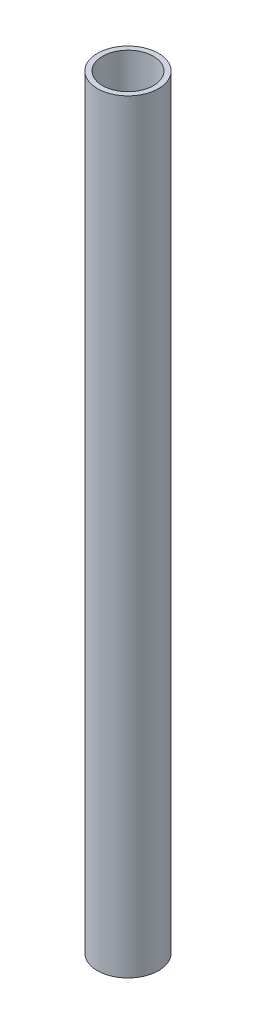
ISO-10303-21;
HEADER;
FILE_DESCRIPTION(('STEP AP214'),'2;1');
FILE_NAME('part.step','',(''),(''),'','','');
FILE_SCHEMA(('AUTOMOTIVE_DESIGN { 1 0 10303 214 1 1 1 1 }'));
ENDSEC;
DATA;
#1=APPLICATION_CONTEXT('core data for automotive mechanical design processes');
#2=APPLICATION_PROTOCOL_DEFINITION('international standard','automotive_design',2000,#1);
#3=PRODUCT_CONTEXT('',#1,'mechanical');
#4=PRODUCT('Part','Part','',(#3));
#5=PRODUCT_RELATED_PRODUCT_CATEGORY('part','',(#4));
#6=PRODUCT_DEFINITION_FORMATION('','',#4);
#7=PRODUCT_DEFINITION_CONTEXT('part definition',#1,'design');
#8=PRODUCT_DEFINITION('design','',#6,#7);
#9=PRODUCT_DEFINITION_SHAPE('','',#8);
#10=(LENGTH_UNIT() NAMED_UNIT(*) SI_UNIT(.MILLI.,.METRE.));
#11=(NAMED_UNIT(*) PLANE_ANGLE_UNIT() SI_UNIT($,.RADIAN.));
#12=(NAMED_UNIT(*) SI_UNIT($,.STERADIAN.) SOLID_ANGLE_UNIT());
#13=UNCERTAINTY_MEASURE_WITH_UNIT(LENGTH_MEASURE(1.E-05),#10,'distance_accuracy_value','');
#14=(GEOMETRIC_REPRESENTATION_CONTEXT(3) GLOBAL_UNCERTAINTY_ASSIGNED_CONTEXT((#13)) GLOBAL_UNIT_ASSIGNED_CONTEXT((#10,
#11,#12)) REPRESENTATION_CONTEXT('',''));
#15=CARTESIAN_POINT('',(0.,0.,0.));
#16=DIRECTION('',(0.,0.,1.));
#17=DIRECTION('',(1.,0.,0.));
#18=AXIS2_PLACEMENT_3D('',#15,#16,#17);
#19=CARTESIAN_POINT('',(0.,150.,0.));
#20=DIRECTION('',(0.,1.,0.));
#21=DIRECTION('',(0.,0.,1.));
#22=AXIS2_PLACEMENT_3D('',#19,#20,#21);
#23=PLANE('',#22);
#24=CARTESIAN_POINT('',(0.,150.,0.));
#25=DIRECTION('',(0.,1.,0.));
#26=DIRECTION('',(0.,0.,1.));
#27=AXIS2_PLACEMENT_3D('',#24,#25,#26);
#28=CIRCLE('',#27,6.);
#29=CARTESIAN_POINT('',(0.,150.,6.));
#30=VERTEX_POINT('',#29);
#31=EDGE_CURVE('E10',#30,#30,#28,.T.);
#32=ORIENTED_EDGE('',*,*,#31,.T.);
#33=EDGE_LOOP('',(#32));
#34=FACE_BOUND('',#33,.T.);
#35=CARTESIAN_POINT('',(0.,150.,0.));
#36=DIRECTION('',(0.,1.,0.));
#37=DIRECTION('',(0.,0.,1.));
#38=AXIS2_PLACEMENT_3D('',#35,#36,#37);
#39=CIRCLE('',#38,5.);
#40=CARTESIAN_POINT('',(0.,150.,5.));
#41=VERTEX_POINT('',#40);
#42=EDGE_CURVE('E56',#41,#41,#39,.T.);
#43=ORIENTED_EDGE('',*,*,#42,.F.);
#44=EDGE_LOOP('',(#43));
#45=FACE_BOUND('',#44,.T.);
#46=ADVANCED_FACE('F43',(#34,#45),#23,.T.);
#47=CARTESIAN_POINT('',(0.,0.,0.));
#48=DIRECTION('',(0.,1.,0.));
#49=DIRECTION('',(0.,0.,1.));
#50=AXIS2_PLACEMENT_3D('',#47,#48,#49);
#51=PLANE('',#50);
#52=CARTESIAN_POINT('',(0.,0.,0.));
#53=DIRECTION('',(0.,1.,0.));
#54=DIRECTION('',(0.,0.,1.));
#55=AXIS2_PLACEMENT_3D('',#52,#53,#54);
#56=CIRCLE('',#55,6.);
#57=CARTESIAN_POINT('',(0.,0.,6.));
#58=VERTEX_POINT('',#57);
#59=EDGE_CURVE('E47',#58,#58,#56,.T.);
#60=ORIENTED_EDGE('',*,*,#59,.F.);
#61=EDGE_LOOP('',(#60));
#62=FACE_BOUND('',#61,.T.);
#63=CARTESIAN_POINT('',(0.,0.,0.));
#64=DIRECTION('',(0.,1.,0.));
#65=DIRECTION('',(0.,0.,1.));
#66=AXIS2_PLACEMENT_3D('',#63,#64,#65);
#67=CIRCLE('',#66,5.);
#68=CARTESIAN_POINT('',(0.,0.,5.));
#69=VERTEX_POINT('',#68);
#70=EDGE_CURVE('E58',#69,#69,#67,.T.);
#71=ORIENTED_EDGE('',*,*,#70,.T.);
#72=EDGE_LOOP('',(#71));
#73=FACE_BOUND('',#72,.T.);
#74=ADVANCED_FACE('F70',(#62,#73),#51,.F.);
#75=CARTESIAN_POINT('',(0.,150.,0.));
#76=DIRECTION('',(0.,-1.,0.));
#77=DIRECTION('',(0.,0.,-1.));
#78=AXIS2_PLACEMENT_3D('',#75,#76,#77);
#79=CYLINDRICAL_SURFACE('',#78,6.);
#80=ORIENTED_EDGE('',*,*,#31,.F.);
#81=EDGE_LOOP('',(#80));
#82=FACE_BOUND('',#81,.T.);
#83=ORIENTED_EDGE('',*,*,#59,.T.);
#84=EDGE_LOOP('',(#83));
#85=FACE_BOUND('',#84,.T.);
#86=ADVANCED_FACE('F45',(#82,#85),#79,.T.);
#87=CARTESIAN_POINT('',(0.,150.,0.));
#88=DIRECTION('',(0.,-1.,0.));
#89=DIRECTION('',(0.,0.,-1.));
#90=AXIS2_PLACEMENT_3D('',#87,#88,#89);
#91=CYLINDRICAL_SURFACE('',#90,5.);
#92=ORIENTED_EDGE('',*,*,#42,.T.);
#93=EDGE_LOOP('',(#92));
#94=FACE_BOUND('',#93,.T.);
#95=ORIENTED_EDGE('',*,*,#70,.F.);
#96=EDGE_LOOP('',(#95));
#97=FACE_BOUND('',#96,.T.);
#98=ADVANCED_FACE('F66',(#94,#97),#91,.F.);
#99=CLOSED_SHELL('',(#46,#74,#86,#98));
#100=MANIFOLD_SOLID_BREP('B2',#99);
#101=ADVANCED_BREP_SHAPE_REPRESENTATION('',(#18,#100),#14);
#102=SHAPE_DEFINITION_REPRESENTATION(#9,#101);
ENDSEC;
END-ISO-10303-21;
